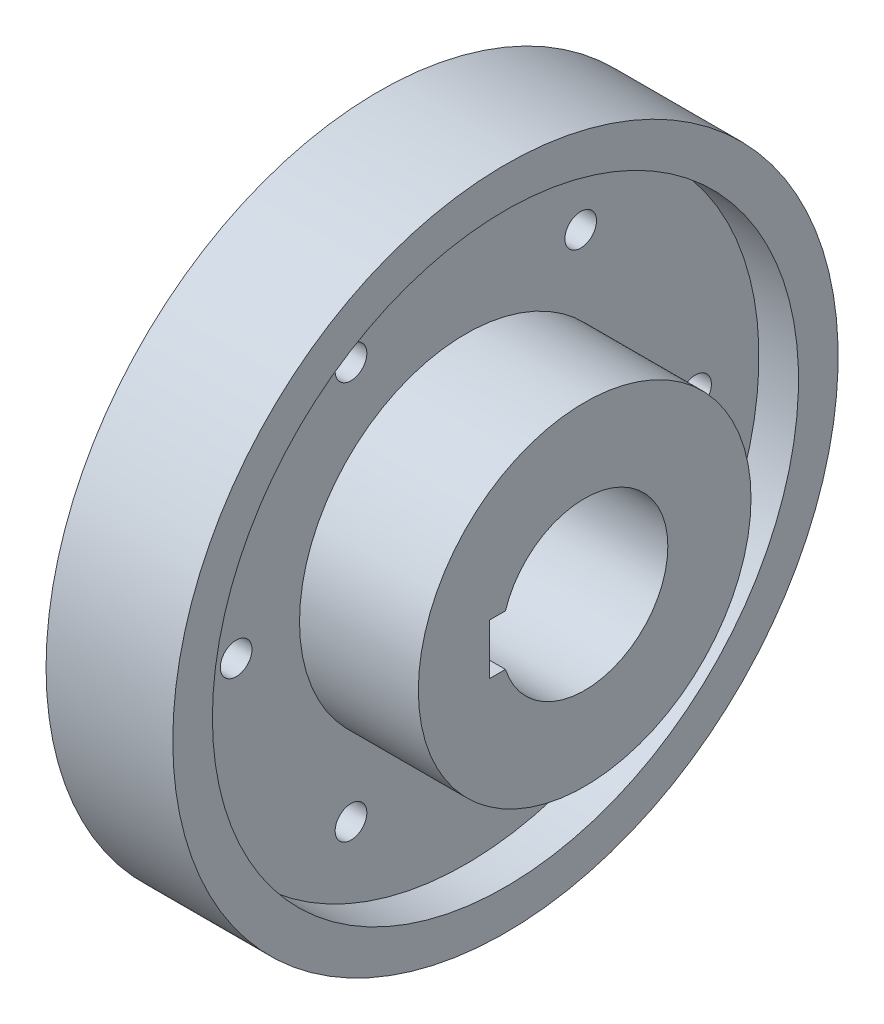
ISO-10303-21;
HEADER;
FILE_DESCRIPTION(('STEP AP214'),'2;1');
FILE_NAME('part.step','',(''),(''),'','','');
FILE_SCHEMA(('AUTOMOTIVE_DESIGN { 1 0 10303 214 1 1 1 1 }'));
ENDSEC;
DATA;
#1=APPLICATION_CONTEXT('core data for automotive mechanical design processes');
#2=APPLICATION_PROTOCOL_DEFINITION('international standard','automotive_design',2000,#1);
#3=PRODUCT_CONTEXT('',#1,'mechanical');
#4=PRODUCT('Part','Part','',(#3));
#5=PRODUCT_RELATED_PRODUCT_CATEGORY('part','',(#4));
#6=PRODUCT_DEFINITION_FORMATION('','',#4);
#7=PRODUCT_DEFINITION_CONTEXT('part definition',#1,'design');
#8=PRODUCT_DEFINITION('design','',#6,#7);
#9=PRODUCT_DEFINITION_SHAPE('','',#8);
#10=(LENGTH_UNIT() NAMED_UNIT(*) SI_UNIT(.MILLI.,.METRE.));
#11=(NAMED_UNIT(*) PLANE_ANGLE_UNIT() SI_UNIT($,.RADIAN.));
#12=(NAMED_UNIT(*) SI_UNIT($,.STERADIAN.) SOLID_ANGLE_UNIT());
#13=UNCERTAINTY_MEASURE_WITH_UNIT(LENGTH_MEASURE(1.E-05),#10,'distance_accuracy_value','');
#14=(GEOMETRIC_REPRESENTATION_CONTEXT(3) GLOBAL_UNCERTAINTY_ASSIGNED_CONTEXT((#13)) GLOBAL_UNIT_ASSIGNED_CONTEXT((#10,
#11,#12)) REPRESENTATION_CONTEXT('',''));
#15=CARTESIAN_POINT('',(0.,0.,0.));
#16=DIRECTION('',(0.,0.,1.));
#17=DIRECTION('',(1.,0.,0.));
#18=AXIS2_PLACEMENT_3D('',#15,#16,#17);
#19=CARTESIAN_POINT('',(138.434782608695,0.,210.));
#20=DIRECTION('',(-1.,0.,0.));
#21=DIRECTION('',(0.,0.,1.));
#22=AXIS2_PLACEMENT_3D('',#19,#20,#21);
#23=PLANE('',#22);
#24=CARTESIAN_POINT('',(138.434782608695,0.,0.));
#25=DIRECTION('',(-1.,0.,0.));
#26=DIRECTION('',(0.,0.,1.));
#27=AXIS2_PLACEMENT_3D('',#24,#25,#26);
#28=CIRCLE('',#27,100.);
#29=CARTESIAN_POINT('',(138.434782608695,0.,100.));
#30=VERTEX_POINT('',#29);
#31=EDGE_CURVE('E125',#30,#30,#28,.T.);
#32=ORIENTED_EDGE('',*,*,#31,.F.);
#33=EDGE_LOOP('',(#32));
#34=FACE_BOUND('',#33,.T.);
#35=CARTESIAN_POINT('',(138.434782608695,-125.573683548743,72.5000000000015));
#36=DIRECTION('',(1.,0.,0.));
#37=DIRECTION('',(0.,0.866025403784433,-0.50000000000001));
#38=AXIS2_PLACEMENT_3D('',#35,#36,#37);
#39=CIRCLE('',#38,10.);
#40=CARTESIAN_POINT('',(138.434782608695,-116.913429510898,67.5000000000014));
#41=VERTEX_POINT('',#40);
#42=EDGE_CURVE('E164',#41,#41,#39,.T.);
#43=ORIENTED_EDGE('',*,*,#42,.T.);
#44=EDGE_LOOP('',(#43));
#45=FACE_BOUND('',#44,.T.);
#46=CARTESIAN_POINT('',(138.434782608695,-125.573683548744,-72.4999999999988));
#47=DIRECTION('',(1.,0.,0.));
#48=DIRECTION('',(0.,0.866025403784443,0.499999999999992));
#49=AXIS2_PLACEMENT_3D('',#46,#47,#48);
#50=CIRCLE('',#49,10.);
#51=CARTESIAN_POINT('',(138.434782608695,-116.9134295109,-67.4999999999989));
#52=VERTEX_POINT('',#51);
#53=EDGE_CURVE('E156',#52,#52,#50,.T.);
#54=ORIENTED_EDGE('',*,*,#53,.T.);
#55=EDGE_LOOP('',(#54));
#56=FACE_BOUND('',#55,.T.);
#57=CARTESIAN_POINT('',(138.434782608695,0.,-145.));
#58=DIRECTION('',(1.,0.,0.));
#59=DIRECTION('',(0.,0.,1.));
#60=AXIS2_PLACEMENT_3D('',#57,#58,#59);
#61=CIRCLE('',#60,10.);
#62=CARTESIAN_POINT('',(138.434782608695,0.,-135.));
#63=VERTEX_POINT('',#62);
#64=EDGE_CURVE('E148',#63,#63,#61,.T.);
#65=ORIENTED_EDGE('',*,*,#64,.T.);
#66=EDGE_LOOP('',(#65));
#67=FACE_BOUND('',#66,.T.);
#68=CARTESIAN_POINT('',(138.434782608695,125.573683548743,-72.5000000000006));
#69=DIRECTION('',(1.,0.,0.));
#70=DIRECTION('',(0.,-0.866025403784436,0.500000000000004));
#71=AXIS2_PLACEMENT_3D('',#68,#69,#70);
#72=CIRCLE('',#71,10.);
#73=CARTESIAN_POINT('',(138.434782608695,116.913429510899,-67.5000000000005));
#74=VERTEX_POINT('',#73);
#75=EDGE_CURVE('E139',#74,#74,#72,.T.);
#76=ORIENTED_EDGE('',*,*,#75,.T.);
#77=EDGE_LOOP('',(#76));
#78=FACE_BOUND('',#77,.T.);
#79=CARTESIAN_POINT('',(138.434782608695,125.573683548744,72.4999999999997));
#80=DIRECTION('',(1.,0.,0.));
#81=DIRECTION('',(0.,-0.86602540378444,-0.499999999999998));
#82=AXIS2_PLACEMENT_3D('',#79,#80,#81);
#83=CIRCLE('',#82,10.);
#84=CARTESIAN_POINT('',(138.434782608695,116.913429510899,67.4999999999997));
#85=VERTEX_POINT('',#84);
#86=EDGE_CURVE('E171',#85,#85,#83,.T.);
#87=ORIENTED_EDGE('',*,*,#86,.T.);
#88=EDGE_LOOP('',(#87));
#89=FACE_BOUND('',#88,.T.);
#90=CARTESIAN_POINT('',(138.434782608695,0.,145.));
#91=DIRECTION('',(1.,0.,0.));
#92=DIRECTION('',(0.,0.,-1.));
#93=AXIS2_PLACEMENT_3D('',#90,#91,#92);
#94=CIRCLE('',#93,10.);
#95=CARTESIAN_POINT('',(138.434782608695,0.,135.));
#96=VERTEX_POINT('',#95);
#97=EDGE_CURVE('E179',#96,#96,#94,.T.);
#98=ORIENTED_EDGE('',*,*,#97,.T.);
#99=EDGE_LOOP('',(#98));
#100=FACE_BOUND('',#99,.T.);
#101=CARTESIAN_POINT('',(138.434782608695,0.,0.));
#102=DIRECTION('',(-1.,0.,0.));
#103=DIRECTION('',(0.,0.,1.));
#104=AXIS2_PLACEMENT_3D('',#101,#102,#103);
#105=CIRCLE('',#104,210.);
#106=CARTESIAN_POINT('',(138.434782608695,0.,210.));
#107=VERTEX_POINT('',#106);
#108=EDGE_CURVE('E183',#107,#107,#105,.T.);
#109=ORIENTED_EDGE('',*,*,#108,.T.);
#110=EDGE_LOOP('',(#109));
#111=FACE_BOUND('',#110,.T.);
#112=ADVANCED_FACE('F45',(#34,#45,#56,#67,#78,#89,#100,#111),#23,.T.);
#113=CARTESIAN_POINT('',(0.,0.,0.));
#114=DIRECTION('',(-1.,0.,0.));
#115=DIRECTION('',(0.,0.,1.));
#116=AXIS2_PLACEMENT_3D('',#113,#114,#115);
#117=CYLINDRICAL_SURFACE('',#116,52.5);
#118=DIRECTION('',(-1.,0.,0.));
#119=VECTOR('',#118,1.);
#120=CARTESIAN_POINT('',(268.434782608695,-16.,50.0024999375031));
#121=LINE('',#120,#119);
#122=CARTESIAN_POINT('',(268.434782608695,-16.,50.0024999375031));
#123=VERTEX_POINT('',#122);
#124=CARTESIAN_POINT('',(128.434782608695,-16.,50.0024999375031));
#125=VERTEX_POINT('',#124);
#126=EDGE_CURVE('E67',#123,#125,#121,.T.);
#127=ORIENTED_EDGE('',*,*,#126,.F.);
#128=CARTESIAN_POINT('',(268.434782608695,0.,0.));
#129=DIRECTION('',(-1.,0.,0.));
#130=DIRECTION('',(0.,0.,1.));
#131=AXIS2_PLACEMENT_3D('',#128,#129,#130);
#132=CIRCLE('',#131,52.4999999999999);
#133=CARTESIAN_POINT('',(268.434782608695,16.,50.0024999375031));
#134=VERTEX_POINT('',#133);
#135=EDGE_CURVE('E11',#134,#123,#132,.T.);
#136=ORIENTED_EDGE('',*,*,#135,.F.);
#137=DIRECTION('',(-1.,0.,0.));
#138=VECTOR('',#137,1.);
#139=CARTESIAN_POINT('',(268.434782608695,16.,50.0024999375031));
#140=LINE('',#139,#138);
#141=CARTESIAN_POINT('',(128.434782608695,16.,50.0024999375031));
#142=VERTEX_POINT('',#141);
#143=EDGE_CURVE('E84',#134,#142,#140,.T.);
#144=ORIENTED_EDGE('',*,*,#143,.T.);
#145=CARTESIAN_POINT('',(128.434782608695,0.,0.));
#146=DIRECTION('',(-1.,0.,0.));
#147=DIRECTION('',(0.,0.,1.));
#148=AXIS2_PLACEMENT_3D('',#145,#146,#147);
#149=CIRCLE('',#148,52.5);
#150=EDGE_CURVE('E87',#142,#125,#149,.T.);
#151=ORIENTED_EDGE('',*,*,#150,.T.);
#152=EDGE_LOOP('',(#127,#136,#144,#151));
#153=FACE_BOUND('',#152,.T.);
#154=ADVANCED_FACE('F86',(#153),#117,.F.);
#155=CARTESIAN_POINT('',(268.434782608695,0.,52.4999999999999));
#156=DIRECTION('',(1.,0.,0.));
#157=DIRECTION('',(0.,0.,-1.));
#158=AXIS2_PLACEMENT_3D('',#155,#156,#157);
#159=PLANE('',#158);
#160=DIRECTION('',(0.,0.,1.));
#161=VECTOR('',#160,1.);
#162=CARTESIAN_POINT('',(268.434782608695,-16.,60.0024999375031));
#163=LINE('',#162,#161);
#164=CARTESIAN_POINT('',(268.434782608695,-16.,60.0024999375031));
#165=VERTEX_POINT('',#164);
#166=EDGE_CURVE('E106',#123,#165,#163,.T.);
#167=ORIENTED_EDGE('',*,*,#166,.T.);
#168=DIRECTION('',(0.,1.,0.));
#169=VECTOR('',#168,1.);
#170=CARTESIAN_POINT('',(268.434782608695,16.,60.0024999375031));
#171=LINE('',#170,#169);
#172=CARTESIAN_POINT('',(268.434782608695,16.,60.0024999375031));
#173=VERTEX_POINT('',#172);
#174=EDGE_CURVE('E112',#165,#173,#171,.T.);
#175=ORIENTED_EDGE('',*,*,#174,.T.);
#176=DIRECTION('',(0.,0.,-1.));
#177=VECTOR('',#176,1.);
#178=CARTESIAN_POINT('',(268.434782608695,16.,60.0024999375031));
#179=LINE('',#178,#177);
#180=EDGE_CURVE('E120',#173,#134,#179,.T.);
#181=ORIENTED_EDGE('',*,*,#180,.T.);
#182=ORIENTED_EDGE('',*,*,#135,.T.);
#183=EDGE_LOOP('',(#167,#175,#181,#182));
#184=FACE_BOUND('',#183,.T.);
#185=CARTESIAN_POINT('',(268.434782608695,0.,0.));
#186=DIRECTION('',(-1.,0.,0.));
#187=DIRECTION('',(0.,0.,1.));
#188=AXIS2_PLACEMENT_3D('',#185,#186,#187);
#189=CIRCLE('',#188,105.);
#190=CARTESIAN_POINT('',(268.434782608695,0.,105.));
#191=VERTEX_POINT('',#190);
#192=EDGE_CURVE('E53',#191,#191,#189,.T.);
#193=ORIENTED_EDGE('',*,*,#192,.F.);
#194=EDGE_LOOP('',(#193));
#195=FACE_BOUND('',#194,.T.);
#196=ADVANCED_FACE('F212',(#184,#195),#159,.T.);
#197=CARTESIAN_POINT('',(0.,0.,0.));
#198=DIRECTION('',(-1.,0.,0.));
#199=DIRECTION('',(0.,0.,1.));
#200=AXIS2_PLACEMENT_3D('',#197,#198,#199);
#201=CYLINDRICAL_SURFACE('',#200,105.);
#202=ORIENTED_EDGE('',*,*,#192,.T.);
#203=EDGE_LOOP('',(#202));
#204=FACE_BOUND('',#203,.T.);
#205=CARTESIAN_POINT('',(193.434782608695,0.,0.));
#206=DIRECTION('',(-1.,0.,0.));
#207=DIRECTION('',(0.,0.,1.));
#208=AXIS2_PLACEMENT_3D('',#205,#206,#207);
#209=CIRCLE('',#208,105.);
#210=CARTESIAN_POINT('',(193.434782608695,0.,105.));
#211=VERTEX_POINT('',#210);
#212=EDGE_CURVE('E202',#211,#211,#209,.T.);
#213=ORIENTED_EDGE('',*,*,#212,.F.);
#214=EDGE_LOOP('',(#213));
#215=FACE_BOUND('',#214,.T.);
#216=ADVANCED_FACE('F209',(#204,#215),#201,.T.);
#217=CARTESIAN_POINT('',(193.434782608695,0.,105.));
#218=DIRECTION('',(1.,0.,0.));
#219=DIRECTION('',(0.,0.,-1.));
#220=AXIS2_PLACEMENT_3D('',#217,#218,#219);
#221=PLANE('',#220);
#222=CARTESIAN_POINT('',(193.434782608695,-125.573683548743,72.5000000000015));
#223=DIRECTION('',(1.,0.,0.));
#224=DIRECTION('',(0.,0.866025403784433,-0.50000000000001));
#225=AXIS2_PLACEMENT_3D('',#222,#223,#224);
#226=CIRCLE('',#225,10.);
#227=CARTESIAN_POINT('',(193.434782608695,-116.913429510898,67.5000000000014));
#228=VERTEX_POINT('',#227);
#229=EDGE_CURVE('E135',#228,#228,#226,.T.);
#230=ORIENTED_EDGE('',*,*,#229,.F.);
#231=EDGE_LOOP('',(#230));
#232=FACE_BOUND('',#231,.T.);
#233=CARTESIAN_POINT('',(193.434782608695,-125.573683548744,-72.4999999999988));
#234=DIRECTION('',(1.,0.,0.));
#235=DIRECTION('',(0.,0.866025403784443,0.499999999999992));
#236=AXIS2_PLACEMENT_3D('',#233,#234,#235);
#237=CIRCLE('',#236,10.);
#238=CARTESIAN_POINT('',(193.434782608695,-116.9134295109,-67.4999999999989));
#239=VERTEX_POINT('',#238);
#240=EDGE_CURVE('E160',#239,#239,#237,.T.);
#241=ORIENTED_EDGE('',*,*,#240,.F.);
#242=EDGE_LOOP('',(#241));
#243=FACE_BOUND('',#242,.T.);
#244=CARTESIAN_POINT('',(193.434782608695,0.,-145.));
#245=DIRECTION('',(1.,0.,0.));
#246=DIRECTION('',(0.,0.,1.));
#247=AXIS2_PLACEMENT_3D('',#244,#245,#246);
#248=CIRCLE('',#247,10.);
#249=CARTESIAN_POINT('',(193.434782608695,0.,-135.));
#250=VERTEX_POINT('',#249);
#251=EDGE_CURVE('E152',#250,#250,#248,.T.);
#252=ORIENTED_EDGE('',*,*,#251,.F.);
#253=EDGE_LOOP('',(#252));
#254=FACE_BOUND('',#253,.T.);
#255=CARTESIAN_POINT('',(193.434782608695,125.573683548743,-72.5000000000006));
#256=DIRECTION('',(1.,0.,0.));
#257=DIRECTION('',(0.,-0.866025403784436,0.500000000000004));
#258=AXIS2_PLACEMENT_3D('',#255,#256,#257);
#259=CIRCLE('',#258,10.);
#260=CARTESIAN_POINT('',(193.434782608695,116.913429510899,-67.5000000000005));
#261=VERTEX_POINT('',#260);
#262=EDGE_CURVE('E144',#261,#261,#259,.T.);
#263=ORIENTED_EDGE('',*,*,#262,.F.);
#264=EDGE_LOOP('',(#263));
#265=FACE_BOUND('',#264,.T.);
#266=CARTESIAN_POINT('',(193.434782608695,125.573683548744,72.4999999999997));
#267=DIRECTION('',(1.,0.,0.));
#268=DIRECTION('',(0.,-0.86602540378444,-0.499999999999998));
#269=AXIS2_PLACEMENT_3D('',#266,#267,#268);
#270=CIRCLE('',#269,10.);
#271=CARTESIAN_POINT('',(193.434782608695,116.913429510899,67.4999999999997));
#272=VERTEX_POINT('',#271);
#273=EDGE_CURVE('E143',#272,#272,#270,.T.);
#274=ORIENTED_EDGE('',*,*,#273,.F.);
#275=EDGE_LOOP('',(#274));
#276=FACE_BOUND('',#275,.T.);
#277=CARTESIAN_POINT('',(193.434782608695,0.,145.));
#278=DIRECTION('',(1.,0.,0.));
#279=DIRECTION('',(0.,0.,-1.));
#280=AXIS2_PLACEMENT_3D('',#277,#278,#279);
#281=CIRCLE('',#280,10.);
#282=CARTESIAN_POINT('',(193.434782608695,0.,135.));
#283=VERTEX_POINT('',#282);
#284=EDGE_CURVE('E175',#283,#283,#281,.T.);
#285=ORIENTED_EDGE('',*,*,#284,.F.);
#286=EDGE_LOOP('',(#285));
#287=FACE_BOUND('',#286,.T.);
#288=ORIENTED_EDGE('',*,*,#212,.T.);
#289=EDGE_LOOP('',(#288));
#290=FACE_BOUND('',#289,.T.);
#291=CARTESIAN_POINT('',(193.434782608695,0.,0.));
#292=DIRECTION('',(-1.,0.,0.));
#293=DIRECTION('',(0.,0.,1.));
#294=AXIS2_PLACEMENT_3D('',#291,#292,#293);
#295=CIRCLE('',#294,185.);
#296=CARTESIAN_POINT('',(193.434782608695,0.,185.));
#297=VERTEX_POINT('',#296);
#298=EDGE_CURVE('E198',#297,#297,#295,.T.);
#299=ORIENTED_EDGE('',*,*,#298,.F.);
#300=EDGE_LOOP('',(#299));
#301=FACE_BOUND('',#300,.T.);
#302=ADVANCED_FACE('F221',(#232,#243,#254,#265,#276,#287,#290,#301),#221,.T.);
#303=CARTESIAN_POINT('',(0.,0.,0.));
#304=DIRECTION('',(-1.,0.,0.));
#305=DIRECTION('',(0.,0.,1.));
#306=AXIS2_PLACEMENT_3D('',#303,#304,#305);
#307=CYLINDRICAL_SURFACE('',#306,185.);
#308=ORIENTED_EDGE('',*,*,#298,.T.);
#309=EDGE_LOOP('',(#308));
#310=FACE_BOUND('',#309,.T.);
#311=CARTESIAN_POINT('',(218.434782608695,0.,0.));
#312=DIRECTION('',(-1.,0.,0.));
#313=DIRECTION('',(0.,0.,1.));
#314=AXIS2_PLACEMENT_3D('',#311,#312,#313);
#315=CIRCLE('',#314,185.);
#316=CARTESIAN_POINT('',(218.434782608695,0.,185.));
#317=VERTEX_POINT('',#316);
#318=EDGE_CURVE('E194',#317,#317,#315,.T.);
#319=ORIENTED_EDGE('',*,*,#318,.F.);
#320=EDGE_LOOP('',(#319));
#321=FACE_BOUND('',#320,.T.);
#322=ADVANCED_FACE('F258',(#310,#321),#307,.F.);
#323=CARTESIAN_POINT('',(218.434782608695,0.,185.));
#324=DIRECTION('',(1.,0.,0.));
#325=DIRECTION('',(0.,0.,-1.));
#326=AXIS2_PLACEMENT_3D('',#323,#324,#325);
#327=PLANE('',#326);
#328=ORIENTED_EDGE('',*,*,#318,.T.);
#329=EDGE_LOOP('',(#328));
#330=FACE_BOUND('',#329,.T.);
#331=CARTESIAN_POINT('',(218.434782608695,0.,0.));
#332=DIRECTION('',(-1.,0.,0.));
#333=DIRECTION('',(0.,0.,1.));
#334=AXIS2_PLACEMENT_3D('',#331,#332,#333);
#335=CIRCLE('',#334,210.);
#336=CARTESIAN_POINT('',(218.434782608695,0.,210.));
#337=VERTEX_POINT('',#336);
#338=EDGE_CURVE('E190',#337,#337,#335,.T.);
#339=ORIENTED_EDGE('',*,*,#338,.F.);
#340=EDGE_LOOP('',(#339));
#341=FACE_BOUND('',#340,.T.);
#342=ADVANCED_FACE('F248',(#330,#341),#327,.T.);
#343=CARTESIAN_POINT('',(0.,0.,0.));
#344=DIRECTION('',(-1.,0.,0.));
#345=DIRECTION('',(0.,0.,1.));
#346=AXIS2_PLACEMENT_3D('',#343,#344,#345);
#347=CYLINDRICAL_SURFACE('',#346,210.);
#348=ORIENTED_EDGE('',*,*,#338,.T.);
#349=EDGE_LOOP('',(#348));
#350=FACE_BOUND('',#349,.T.);
#351=ORIENTED_EDGE('',*,*,#108,.F.);
#352=EDGE_LOOP('',(#351));
#353=FACE_BOUND('',#352,.T.);
#354=ADVANCED_FACE('F245',(#350,#353),#347,.T.);
#355=CARTESIAN_POINT('',(138.434782608695,0.,145.));
#356=DIRECTION('',(1.,0.,0.));
#357=DIRECTION('',(0.,0.,-1.));
#358=AXIS2_PLACEMENT_3D('',#355,#356,#357);
#359=CYLINDRICAL_SURFACE('',#358,10.);
#360=ORIENTED_EDGE('',*,*,#97,.F.);
#361=EDGE_LOOP('',(#360));
#362=FACE_BOUND('',#361,.T.);
#363=ORIENTED_EDGE('',*,*,#284,.T.);
#364=EDGE_LOOP('',(#363));
#365=FACE_BOUND('',#364,.T.);
#366=ADVANCED_FACE('F247',(#362,#365),#359,.F.);
#367=CARTESIAN_POINT('',(138.434782608695,125.573683548744,72.4999999999997));
#368=DIRECTION('',(1.,0.,0.));
#369=DIRECTION('',(0.,0.,-1.));
#370=AXIS2_PLACEMENT_3D('',#367,#368,#369);
#371=CYLINDRICAL_SURFACE('',#370,10.);
#372=ORIENTED_EDGE('',*,*,#86,.F.);
#373=EDGE_LOOP('',(#372));
#374=FACE_BOUND('',#373,.T.);
#375=ORIENTED_EDGE('',*,*,#273,.T.);
#376=EDGE_LOOP('',(#375));
#377=FACE_BOUND('',#376,.T.);
#378=ADVANCED_FACE('F255',(#374,#377),#371,.F.);
#379=CARTESIAN_POINT('',(138.434782608695,125.573683548743,-72.5000000000006));
#380=DIRECTION('',(1.,0.,0.));
#381=DIRECTION('',(0.,0.,-1.));
#382=AXIS2_PLACEMENT_3D('',#379,#380,#381);
#383=CYLINDRICAL_SURFACE('',#382,10.);
#384=ORIENTED_EDGE('',*,*,#75,.F.);
#385=EDGE_LOOP('',(#384));
#386=FACE_BOUND('',#385,.T.);
#387=ORIENTED_EDGE('',*,*,#262,.T.);
#388=EDGE_LOOP('',(#387));
#389=FACE_BOUND('',#388,.T.);
#390=ADVANCED_FACE('F292',(#386,#389),#383,.F.);
#391=CARTESIAN_POINT('',(138.434782608695,0.,-145.));
#392=DIRECTION('',(1.,0.,0.));
#393=DIRECTION('',(0.,0.,-1.));
#394=AXIS2_PLACEMENT_3D('',#391,#392,#393);
#395=CYLINDRICAL_SURFACE('',#394,10.);
#396=ORIENTED_EDGE('',*,*,#64,.F.);
#397=EDGE_LOOP('',(#396));
#398=FACE_BOUND('',#397,.T.);
#399=ORIENTED_EDGE('',*,*,#251,.T.);
#400=EDGE_LOOP('',(#399));
#401=FACE_BOUND('',#400,.T.);
#402=ADVANCED_FACE('F297',(#398,#401),#395,.F.);
#403=CARTESIAN_POINT('',(138.434782608695,-125.573683548744,-72.4999999999988));
#404=DIRECTION('',(1.,0.,0.));
#405=DIRECTION('',(0.,0.,-1.));
#406=AXIS2_PLACEMENT_3D('',#403,#404,#405);
#407=CYLINDRICAL_SURFACE('',#406,10.);
#408=ORIENTED_EDGE('',*,*,#53,.F.);
#409=EDGE_LOOP('',(#408));
#410=FACE_BOUND('',#409,.T.);
#411=ORIENTED_EDGE('',*,*,#240,.T.);
#412=EDGE_LOOP('',(#411));
#413=FACE_BOUND('',#412,.T.);
#414=ADVANCED_FACE('F304',(#410,#413),#407,.F.);
#415=CARTESIAN_POINT('',(138.434782608695,-125.573683548743,72.5000000000015));
#416=DIRECTION('',(1.,0.,0.));
#417=DIRECTION('',(0.,0.,-1.));
#418=AXIS2_PLACEMENT_3D('',#415,#416,#417);
#419=CYLINDRICAL_SURFACE('',#418,10.);
#420=ORIENTED_EDGE('',*,*,#42,.F.);
#421=EDGE_LOOP('',(#420));
#422=FACE_BOUND('',#421,.T.);
#423=ORIENTED_EDGE('',*,*,#229,.T.);
#424=EDGE_LOOP('',(#423));
#425=FACE_BOUND('',#424,.T.);
#426=ADVANCED_FACE('F301',(#422,#425),#419,.F.);
#427=CARTESIAN_POINT('',(128.434782608695,0.,0.));
#428=DIRECTION('',(1.,0.,0.));
#429=DIRECTION('',(0.,0.,-1.));
#430=AXIS2_PLACEMENT_3D('',#427,#428,#429);
#431=CYLINDRICAL_SURFACE('',#430,100.);
#432=CARTESIAN_POINT('',(128.434782608695,0.,0.));
#433=DIRECTION('',(-1.,0.,0.));
#434=DIRECTION('',(0.,0.,1.));
#435=AXIS2_PLACEMENT_3D('',#432,#433,#434);
#436=CIRCLE('',#435,100.);
#437=CARTESIAN_POINT('',(128.434782608695,0.,100.));
#438=VERTEX_POINT('',#437);
#439=EDGE_CURVE('E131',#438,#438,#436,.T.);
#440=ORIENTED_EDGE('',*,*,#439,.F.);
#441=EDGE_LOOP('',(#440));
#442=FACE_BOUND('',#441,.T.);
#443=ORIENTED_EDGE('',*,*,#31,.T.);
#444=EDGE_LOOP('',(#443));
#445=FACE_BOUND('',#444,.T.);
#446=ADVANCED_FACE('F303',(#442,#445),#431,.T.);
#447=CARTESIAN_POINT('',(128.434782608695,0.,0.));
#448=DIRECTION('',(-1.,0.,0.));
#449=DIRECTION('',(0.,0.,1.));
#450=AXIS2_PLACEMENT_3D('',#447,#448,#449);
#451=PLANE('',#450);
#452=ORIENTED_EDGE('',*,*,#150,.F.);
#453=DIRECTION('',(0.,0.,-1.));
#454=VECTOR('',#453,1.);
#455=CARTESIAN_POINT('',(128.434782608695,16.,60.0024999375031));
#456=LINE('',#455,#454);
#457=CARTESIAN_POINT('',(128.434782608695,16.,60.0024999375031));
#458=VERTEX_POINT('',#457);
#459=EDGE_CURVE('E100',#458,#142,#456,.T.);
#460=ORIENTED_EDGE('',*,*,#459,.F.);
#461=DIRECTION('',(0.,1.,0.));
#462=VECTOR('',#461,1.);
#463=CARTESIAN_POINT('',(128.434782608695,16.,60.0024999375031));
#464=LINE('',#463,#462);
#465=CARTESIAN_POINT('',(128.434782608695,-16.,60.0024999375031));
#466=VERTEX_POINT('',#465);
#467=EDGE_CURVE('E107',#466,#458,#464,.T.);
#468=ORIENTED_EDGE('',*,*,#467,.F.);
#469=DIRECTION('',(0.,0.,1.));
#470=VECTOR('',#469,1.);
#471=CARTESIAN_POINT('',(128.434782608695,-16.,60.0024999375031));
#472=LINE('',#471,#470);
#473=EDGE_CURVE('E60',#125,#466,#472,.T.);
#474=ORIENTED_EDGE('',*,*,#473,.F.);
#475=EDGE_LOOP('',(#452,#460,#468,#474));
#476=FACE_BOUND('',#475,.T.);
#477=ORIENTED_EDGE('',*,*,#439,.T.);
#478=EDGE_LOOP('',(#477));
#479=FACE_BOUND('',#478,.T.);
#480=ADVANCED_FACE('F97',(#476,#479),#451,.T.);
#481=CARTESIAN_POINT('',(268.434782608695,-16.,60.0024999375031));
#482=DIRECTION('',(0.,-1.,0.));
#483=DIRECTION('',(0.,0.,-1.));
#484=AXIS2_PLACEMENT_3D('',#481,#482,#483);
#485=PLANE('',#484);
#486=DIRECTION('',(-1.,0.,0.));
#487=VECTOR('',#486,1.);
#488=CARTESIAN_POINT('',(268.434782608695,-16.,60.0024999375031));
#489=LINE('',#488,#487);
#490=EDGE_CURVE('E123',#165,#466,#489,.T.);
#491=ORIENTED_EDGE('',*,*,#490,.F.);
#492=ORIENTED_EDGE('',*,*,#166,.F.);
#493=ORIENTED_EDGE('',*,*,#126,.T.);
#494=ORIENTED_EDGE('',*,*,#473,.T.);
#495=EDGE_LOOP('',(#491,#492,#493,#494));
#496=FACE_BOUND('',#495,.T.);
#497=ADVANCED_FACE('F316',(#496),#485,.F.);
#498=CARTESIAN_POINT('',(268.434782608695,16.,60.0024999375031));
#499=DIRECTION('',(0.,1.,0.));
#500=DIRECTION('',(0.,0.,1.));
#501=AXIS2_PLACEMENT_3D('',#498,#499,#500);
#502=PLANE('',#501);
#503=ORIENTED_EDGE('',*,*,#143,.F.);
#504=ORIENTED_EDGE('',*,*,#180,.F.);
#505=DIRECTION('',(-1.,0.,0.));
#506=VECTOR('',#505,1.);
#507=CARTESIAN_POINT('',(268.434782608695,16.,60.0024999375031));
#508=LINE('',#507,#506);
#509=EDGE_CURVE('E93',#173,#458,#508,.T.);
#510=ORIENTED_EDGE('',*,*,#509,.T.);
#511=ORIENTED_EDGE('',*,*,#459,.T.);
#512=EDGE_LOOP('',(#503,#504,#510,#511));
#513=FACE_BOUND('',#512,.T.);
#514=ADVANCED_FACE('F103',(#513),#502,.F.);
#515=CARTESIAN_POINT('',(268.434782608695,16.,60.0024999375031));
#516=DIRECTION('',(0.,0.,1.));
#517=DIRECTION('',(1.,0.,0.));
#518=AXIS2_PLACEMENT_3D('',#515,#516,#517);
#519=PLANE('',#518);
#520=ORIENTED_EDGE('',*,*,#509,.F.);
#521=ORIENTED_EDGE('',*,*,#174,.F.);
#522=ORIENTED_EDGE('',*,*,#490,.T.);
#523=ORIENTED_EDGE('',*,*,#467,.T.);
#524=EDGE_LOOP('',(#520,#521,#522,#523));
#525=FACE_BOUND('',#524,.T.);
#526=ADVANCED_FACE('F319',(#525),#519,.F.);
#527=CLOSED_SHELL('',(#112,#154,#196,#216,#302,#322,#342,#354,#366,#378,#390,#402,#414,#426,
#446,#480,#497,#514,#526));
#528=MANIFOLD_SOLID_BREP('B2',#527);
#529=ADVANCED_BREP_SHAPE_REPRESENTATION('',(#18,#528),#14);
#530=SHAPE_DEFINITION_REPRESENTATION(#9,#529);
ENDSEC;
END-ISO-10303-21;
